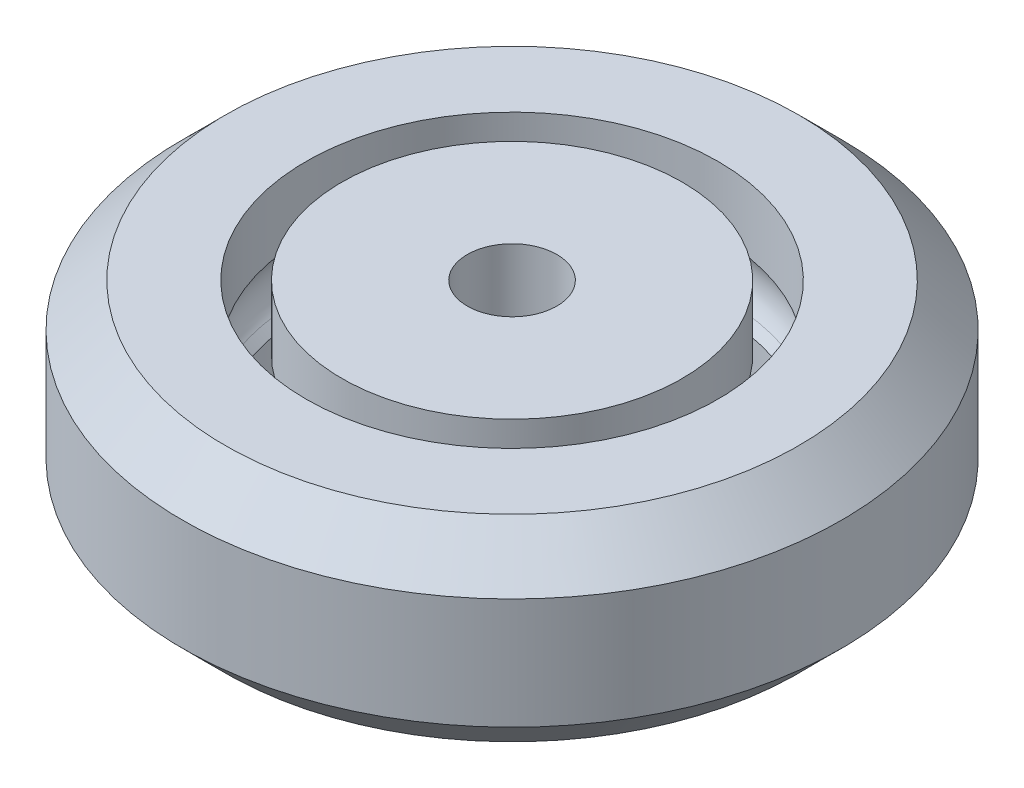
ISO-10303-21;
HEADER;
FILE_DESCRIPTION(('STEP AP214'),'2;1');
FILE_NAME('part.step','',(''),(''),'','','');
FILE_SCHEMA(('AUTOMOTIVE_DESIGN { 1 0 10303 214 1 1 1 1 }'));
ENDSEC;
DATA;
#1=APPLICATION_CONTEXT('core data for automotive mechanical design processes');
#2=APPLICATION_PROTOCOL_DEFINITION('international standard','automotive_design',2000,#1);
#3=PRODUCT_CONTEXT('',#1,'mechanical');
#4=PRODUCT('Part','Part','',(#3));
#5=PRODUCT_RELATED_PRODUCT_CATEGORY('part','',(#4));
#6=PRODUCT_DEFINITION_FORMATION('','',#4);
#7=PRODUCT_DEFINITION_CONTEXT('part definition',#1,'design');
#8=PRODUCT_DEFINITION('design','',#6,#7);
#9=PRODUCT_DEFINITION_SHAPE('','',#8);
#10=(LENGTH_UNIT() NAMED_UNIT(*) SI_UNIT(.MILLI.,.METRE.));
#11=(NAMED_UNIT(*) PLANE_ANGLE_UNIT() SI_UNIT($,.RADIAN.));
#12=(NAMED_UNIT(*) SI_UNIT($,.STERADIAN.) SOLID_ANGLE_UNIT());
#13=UNCERTAINTY_MEASURE_WITH_UNIT(LENGTH_MEASURE(1.E-05),#10,'distance_accuracy_value','');
#14=(GEOMETRIC_REPRESENTATION_CONTEXT(3) GLOBAL_UNCERTAINTY_ASSIGNED_CONTEXT((#13)) GLOBAL_UNIT_ASSIGNED_CONTEXT((#10,
#11,#12)) REPRESENTATION_CONTEXT('',''));
#15=CARTESIAN_POINT('',(0.,0.,0.));
#16=DIRECTION('',(0.,0.,1.));
#17=DIRECTION('',(1.,0.,0.));
#18=AXIS2_PLACEMENT_3D('',#15,#16,#17);
#19=CARTESIAN_POINT('',(0.,0.,0.));
#20=DIRECTION('',(0.,-1.,0.));
#21=DIRECTION('',(0.,0.,-1.));
#22=AXIS2_PLACEMENT_3D('',#19,#20,#21);
#23=TOROIDAL_SURFACE('',#22,10.5,2.025);
#24=CARTESIAN_POINT('',(0.,1.43189123190276,0.));
#25=DIRECTION('',(0.,-1.,0.));
#26=DIRECTION('',(0.,0.,-1.));
#27=AXIS2_PLACEMENT_3D('',#24,#25,#26);
#28=CIRCLE('',#27,11.9318912319028);
#29=CARTESIAN_POINT('',(0.,1.43189123190276,-11.9318912319028));
#30=VERTEX_POINT('',#29);
#31=EDGE_CURVE('E93',#30,#30,#28,.T.);
#32=ORIENTED_EDGE('',*,*,#31,.F.);
#33=EDGE_LOOP('',(#32));
#34=FACE_BOUND('',#33,.T.);
#35=CARTESIAN_POINT('',(0.,-1.43189123190276,0.));
#36=DIRECTION('',(0.,-1.,0.));
#37=DIRECTION('',(0.,0.,-1.));
#38=AXIS2_PLACEMENT_3D('',#35,#36,#37);
#39=CIRCLE('',#38,11.9318912319028);
#40=CARTESIAN_POINT('',(0.,-1.43189123190276,-11.9318912319028));
#41=VERTEX_POINT('',#40);
#42=EDGE_CURVE('E11',#41,#41,#39,.T.);
#43=ORIENTED_EDGE('',*,*,#42,.T.);
#44=EDGE_LOOP('',(#43));
#45=FACE_BOUND('',#44,.T.);
#46=ADVANCED_FACE('F50',(#34,#45),#23,.F.);
#47=CARTESIAN_POINT('',(0.,-1.43189123190276,0.));
#48=DIRECTION('',(0.,1.,0.));
#49=DIRECTION('',(0.,0.,1.));
#50=AXIS2_PLACEMENT_3D('',#47,#48,#49);
#51=CONICAL_SURFACE('',#50,11.9318912319028,0.785398163397442);
#52=CARTESIAN_POINT('',(0.,-1.86378246380552,0.));
#53=DIRECTION('',(0.,-1.,0.));
#54=DIRECTION('',(0.,0.,-1.));
#55=AXIS2_PLACEMENT_3D('',#52,#53,#54);
#56=CIRCLE('',#55,11.5);
#57=CARTESIAN_POINT('',(0.,-1.86378246380552,-11.5));
#58=VERTEX_POINT('',#57);
#59=EDGE_CURVE('E57',#58,#58,#56,.T.);
#60=ORIENTED_EDGE('',*,*,#59,.T.);
#61=EDGE_LOOP('',(#60));
#62=FACE_BOUND('',#61,.T.);
#63=ORIENTED_EDGE('',*,*,#42,.F.);
#64=EDGE_LOOP('',(#63));
#65=FACE_BOUND('',#64,.T.);
#66=ADVANCED_FACE('F101',(#62,#65),#51,.F.);
#67=CARTESIAN_POINT('',(0.,0.,0.));
#68=DIRECTION('',(0.,-1.,0.));
#69=DIRECTION('',(0.,0.,-1.));
#70=AXIS2_PLACEMENT_3D('',#67,#68,#69);
#71=CYLINDRICAL_SURFACE('',#70,11.5);
#72=CARTESIAN_POINT('',(0.,-5.5,0.));
#73=DIRECTION('',(0.,-1.,0.));
#74=DIRECTION('',(0.,0.,-1.));
#75=AXIS2_PLACEMENT_3D('',#72,#73,#74);
#76=CIRCLE('',#75,11.5);
#77=CARTESIAN_POINT('',(0.,-5.5,-11.5));
#78=VERTEX_POINT('',#77);
#79=EDGE_CURVE('E62',#78,#78,#76,.T.);
#80=ORIENTED_EDGE('',*,*,#79,.T.);
#81=EDGE_LOOP('',(#80));
#82=FACE_BOUND('',#81,.T.);
#83=ORIENTED_EDGE('',*,*,#59,.F.);
#84=EDGE_LOOP('',(#83));
#85=FACE_BOUND('',#84,.T.);
#86=ADVANCED_FACE('F105',(#82,#85),#71,.F.);
#87=CARTESIAN_POINT('',(0.,-5.5,0.));
#88=DIRECTION('',(0.,-1.,0.));
#89=DIRECTION('',(0.,0.,-1.));
#90=AXIS2_PLACEMENT_3D('',#87,#88,#89);
#91=PLANE('',#90);
#92=CARTESIAN_POINT('',(0.,-5.5,0.));
#93=DIRECTION('',(0.,-1.,0.));
#94=DIRECTION('',(0.,0.,-1.));
#95=AXIS2_PLACEMENT_3D('',#92,#93,#94);
#96=CIRCLE('',#95,16.);
#97=CARTESIAN_POINT('',(0.,-5.5,-16.));
#98=VERTEX_POINT('',#97);
#99=EDGE_CURVE('E67',#98,#98,#96,.T.);
#100=ORIENTED_EDGE('',*,*,#99,.T.);
#101=EDGE_LOOP('',(#100));
#102=FACE_BOUND('',#101,.T.);
#103=ORIENTED_EDGE('',*,*,#79,.F.);
#104=EDGE_LOOP('',(#103));
#105=FACE_BOUND('',#104,.T.);
#106=ADVANCED_FACE('F109',(#102,#105),#91,.T.);
#107=CARTESIAN_POINT('',(0.,-3.1,0.));
#108=DIRECTION('',(0.,1.,0.));
#109=DIRECTION('',(0.,0.,1.));
#110=AXIS2_PLACEMENT_3D('',#107,#108,#109);
#111=CONICAL_SURFACE('',#110,18.4,0.785398163397442);
#112=ORIENTED_EDGE('',*,*,#99,.F.);
#113=EDGE_LOOP('',(#112));
#114=FACE_BOUND('',#113,.T.);
#115=CARTESIAN_POINT('',(0.,-3.1,0.));
#116=DIRECTION('',(0.,-1.,0.));
#117=DIRECTION('',(0.,0.,-1.));
#118=AXIS2_PLACEMENT_3D('',#115,#116,#117);
#119=CIRCLE('',#118,18.4);
#120=CARTESIAN_POINT('',(0.,-3.1,-18.4));
#121=VERTEX_POINT('',#120);
#122=EDGE_CURVE('E73',#121,#121,#119,.T.);
#123=ORIENTED_EDGE('',*,*,#122,.T.);
#124=EDGE_LOOP('',(#123));
#125=FACE_BOUND('',#124,.T.);
#126=ADVANCED_FACE('F116',(#114,#125),#111,.T.);
#127=CARTESIAN_POINT('',(0.,0.,0.));
#128=DIRECTION('',(0.,-1.,0.));
#129=DIRECTION('',(0.,0.,-1.));
#130=AXIS2_PLACEMENT_3D('',#127,#128,#129);
#131=CYLINDRICAL_SURFACE('',#130,18.4);
#132=CARTESIAN_POINT('',(0.,3.1,0.));
#133=DIRECTION('',(0.,-1.,0.));
#134=DIRECTION('',(0.,0.,-1.));
#135=AXIS2_PLACEMENT_3D('',#132,#133,#134);
#136=CIRCLE('',#135,18.4);
#137=CARTESIAN_POINT('',(0.,3.1,-18.4));
#138=VERTEX_POINT('',#137);
#139=EDGE_CURVE('E77',#138,#138,#136,.T.);
#140=ORIENTED_EDGE('',*,*,#139,.T.);
#141=EDGE_LOOP('',(#140));
#142=FACE_BOUND('',#141,.T.);
#143=ORIENTED_EDGE('',*,*,#122,.F.);
#144=EDGE_LOOP('',(#143));
#145=FACE_BOUND('',#144,.T.);
#146=ADVANCED_FACE('F120',(#142,#145),#131,.T.);
#147=CARTESIAN_POINT('',(0.,3.1,0.));
#148=DIRECTION('',(0.,-1.,0.));
#149=DIRECTION('',(0.,0.,-1.));
#150=AXIS2_PLACEMENT_3D('',#147,#148,#149);
#151=CONICAL_SURFACE('',#150,18.4,0.785398163397442);
#152=CARTESIAN_POINT('',(0.,5.5,0.));
#153=DIRECTION('',(0.,-1.,0.));
#154=DIRECTION('',(0.,0.,-1.));
#155=AXIS2_PLACEMENT_3D('',#152,#153,#154);
#156=CIRCLE('',#155,16.);
#157=CARTESIAN_POINT('',(0.,5.5,-16.));
#158=VERTEX_POINT('',#157);
#159=EDGE_CURVE('E81',#158,#158,#156,.T.);
#160=ORIENTED_EDGE('',*,*,#159,.T.);
#161=EDGE_LOOP('',(#160));
#162=FACE_BOUND('',#161,.T.);
#163=ORIENTED_EDGE('',*,*,#139,.F.);
#164=EDGE_LOOP('',(#163));
#165=FACE_BOUND('',#164,.T.);
#166=ADVANCED_FACE('F124',(#162,#165),#151,.T.);
#167=CARTESIAN_POINT('',(0.,5.5,0.));
#168=DIRECTION('',(0.,-1.,0.));
#169=DIRECTION('',(0.,0.,-1.));
#170=AXIS2_PLACEMENT_3D('',#167,#168,#169);
#171=PLANE('',#170);
#172=ORIENTED_EDGE('',*,*,#159,.F.);
#173=EDGE_LOOP('',(#172));
#174=FACE_BOUND('',#173,.T.);
#175=CARTESIAN_POINT('',(0.,5.5,0.));
#176=DIRECTION('',(0.,-1.,0.));
#177=DIRECTION('',(0.,0.,-1.));
#178=AXIS2_PLACEMENT_3D('',#175,#176,#177);
#179=CIRCLE('',#178,11.5);
#180=CARTESIAN_POINT('',(0.,5.5,-11.5));
#181=VERTEX_POINT('',#180);
#182=EDGE_CURVE('E85',#181,#181,#179,.T.);
#183=ORIENTED_EDGE('',*,*,#182,.T.);
#184=EDGE_LOOP('',(#183));
#185=FACE_BOUND('',#184,.T.);
#186=ADVANCED_FACE('F128',(#174,#185),#171,.F.);
#187=CARTESIAN_POINT('',(0.,0.,0.));
#188=DIRECTION('',(0.,-1.,0.));
#189=DIRECTION('',(0.,0.,-1.));
#190=AXIS2_PLACEMENT_3D('',#187,#188,#189);
#191=CYLINDRICAL_SURFACE('',#190,11.5);
#192=ORIENTED_EDGE('',*,*,#182,.F.);
#193=EDGE_LOOP('',(#192));
#194=FACE_BOUND('',#193,.T.);
#195=CARTESIAN_POINT('',(0.,1.86378246380552,0.));
#196=DIRECTION('',(0.,-1.,0.));
#197=DIRECTION('',(0.,0.,-1.));
#198=AXIS2_PLACEMENT_3D('',#195,#196,#197);
#199=CIRCLE('',#198,11.5);
#200=CARTESIAN_POINT('',(0.,1.86378246380552,-11.5));
#201=VERTEX_POINT('',#200);
#202=EDGE_CURVE('E89',#201,#201,#199,.T.);
#203=ORIENTED_EDGE('',*,*,#202,.T.);
#204=EDGE_LOOP('',(#203));
#205=FACE_BOUND('',#204,.T.);
#206=ADVANCED_FACE('F132',(#194,#205),#191,.F.);
#207=CARTESIAN_POINT('',(0.,1.43189123190276,0.));
#208=DIRECTION('',(0.,-1.,0.));
#209=DIRECTION('',(0.,0.,-1.));
#210=AXIS2_PLACEMENT_3D('',#207,#208,#209);
#211=CONICAL_SURFACE('',#210,11.9318912319028,0.785398163397442);
#212=ORIENTED_EDGE('',*,*,#202,.F.);
#213=EDGE_LOOP('',(#212));
#214=FACE_BOUND('',#213,.T.);
#215=ORIENTED_EDGE('',*,*,#31,.T.);
#216=EDGE_LOOP('',(#215));
#217=FACE_BOUND('',#216,.T.);
#218=ADVANCED_FACE('F98',(#214,#217),#211,.F.);
#219=CLOSED_SHELL('',(#46,#66,#86,#106,#126,#146,#166,#186,#206,#218));
#220=MANIFOLD_SOLID_BREP('B2',#219);
#221=CARTESIAN_POINT('',(0.,5.5,0.));
#222=DIRECTION('',(0.,1.,0.));
#223=DIRECTION('',(0.,0.,1.));
#224=AXIS2_PLACEMENT_3D('',#221,#222,#223);
#225=PLANE('',#224);
#226=CARTESIAN_POINT('',(0.,5.5,0.));
#227=DIRECTION('',(0.,-1.,0.));
#228=DIRECTION('',(0.,0.,-1.));
#229=AXIS2_PLACEMENT_3D('',#226,#227,#228);
#230=CIRCLE('',#229,2.5);
#231=CARTESIAN_POINT('',(0.,5.5,-2.5));
#232=VERTEX_POINT('',#231);
#233=EDGE_CURVE('E49',#232,#232,#230,.T.);
#234=ORIENTED_EDGE('',*,*,#233,.T.);
#235=EDGE_LOOP('',(#234));
#236=FACE_BOUND('',#235,.T.);
#237=CARTESIAN_POINT('',(0.,5.5,0.));
#238=DIRECTION('',(0.,-1.,0.));
#239=DIRECTION('',(0.,0.,-1.));
#240=AXIS2_PLACEMENT_3D('',#237,#238,#239);
#241=CIRCLE('',#240,9.5);
#242=CARTESIAN_POINT('',(0.,5.5,-9.5));
#243=VERTEX_POINT('',#242);
#244=EDGE_CURVE('E259',#243,#243,#241,.T.);
#245=ORIENTED_EDGE('',*,*,#244,.F.);
#246=EDGE_LOOP('',(#245));
#247=FACE_BOUND('',#246,.T.);
#248=ADVANCED_FACE('F231',(#236,#247),#225,.T.);
#249=CARTESIAN_POINT('',(0.,0.,0.));
#250=DIRECTION('',(0.,-1.,0.));
#251=DIRECTION('',(0.,0.,-1.));
#252=AXIS2_PLACEMENT_3D('',#249,#250,#251);
#253=CYLINDRICAL_SURFACE('',#252,2.5);
#254=CARTESIAN_POINT('',(0.,-5.5,0.));
#255=DIRECTION('',(0.,-1.,0.));
#256=DIRECTION('',(0.,0.,-1.));
#257=AXIS2_PLACEMENT_3D('',#254,#255,#256);
#258=CIRCLE('',#257,2.5);
#259=CARTESIAN_POINT('',(0.,-5.5,-2.5));
#260=VERTEX_POINT('',#259);
#261=EDGE_CURVE('E237',#260,#260,#258,.T.);
#262=ORIENTED_EDGE('',*,*,#261,.T.);
#263=EDGE_LOOP('',(#262));
#264=FACE_BOUND('',#263,.T.);
#265=ORIENTED_EDGE('',*,*,#233,.F.);
#266=EDGE_LOOP('',(#265));
#267=FACE_BOUND('',#266,.T.);
#268=ADVANCED_FACE('F267',(#264,#267),#253,.F.);
#269=CARTESIAN_POINT('',(0.,-5.5,0.));
#270=DIRECTION('',(0.,1.,0.));
#271=DIRECTION('',(0.,0.,1.));
#272=AXIS2_PLACEMENT_3D('',#269,#270,#271);
#273=PLANE('',#272);
#274=ORIENTED_EDGE('',*,*,#261,.F.);
#275=EDGE_LOOP('',(#274));
#276=FACE_BOUND('',#275,.T.);
#277=CARTESIAN_POINT('',(0.,-5.5,0.));
#278=DIRECTION('',(0.,-1.,0.));
#279=DIRECTION('',(0.,0.,-1.));
#280=AXIS2_PLACEMENT_3D('',#277,#278,#279);
#281=CIRCLE('',#280,9.5);
#282=CARTESIAN_POINT('',(0.,-5.5,-9.5));
#283=VERTEX_POINT('',#282);
#284=EDGE_CURVE('E241',#283,#283,#281,.T.);
#285=ORIENTED_EDGE('',*,*,#284,.T.);
#286=EDGE_LOOP('',(#285));
#287=FACE_BOUND('',#286,.T.);
#288=ADVANCED_FACE('F271',(#276,#287),#273,.F.);
#289=CARTESIAN_POINT('',(0.,0.,0.));
#290=DIRECTION('',(0.,-1.,0.));
#291=DIRECTION('',(0.,0.,-1.));
#292=AXIS2_PLACEMENT_3D('',#289,#290,#291);
#293=CYLINDRICAL_SURFACE('',#292,9.5);
#294=ORIENTED_EDGE('',*,*,#284,.F.);
#295=EDGE_LOOP('',(#294));
#296=FACE_BOUND('',#295,.T.);
#297=CARTESIAN_POINT('',(0.,-1.86378246380552,0.));
#298=DIRECTION('',(0.,-1.,0.));
#299=DIRECTION('',(0.,0.,-1.));
#300=AXIS2_PLACEMENT_3D('',#297,#298,#299);
#301=CIRCLE('',#300,9.5);
#302=CARTESIAN_POINT('',(0.,-1.86378246380552,-9.5));
#303=VERTEX_POINT('',#302);
#304=EDGE_CURVE('E245',#303,#303,#301,.T.);
#305=ORIENTED_EDGE('',*,*,#304,.T.);
#306=EDGE_LOOP('',(#305));
#307=FACE_BOUND('',#306,.T.);
#308=ADVANCED_FACE('F275',(#296,#307),#293,.T.);
#309=CARTESIAN_POINT('',(0.,-1.43189123190275,0.));
#310=DIRECTION('',(0.,-1.,0.));
#311=DIRECTION('',(0.,0.,-1.));
#312=AXIS2_PLACEMENT_3D('',#309,#310,#311);
#313=CONICAL_SURFACE('',#312,9.06810876809724,0.785398163397443);
#314=ORIENTED_EDGE('',*,*,#304,.F.);
#315=EDGE_LOOP('',(#314));
#316=FACE_BOUND('',#315,.T.);
#317=CARTESIAN_POINT('',(0.,-1.43189123190275,0.));
#318=DIRECTION('',(0.,-1.,0.));
#319=DIRECTION('',(0.,0.,-1.));
#320=AXIS2_PLACEMENT_3D('',#317,#318,#319);
#321=CIRCLE('',#320,9.06810876809724);
#322=CARTESIAN_POINT('',(0.,-1.43189123190275,-9.06810876809724));
#323=VERTEX_POINT('',#322);
#324=EDGE_CURVE('E250',#323,#323,#321,.T.);
#325=ORIENTED_EDGE('',*,*,#324,.T.);
#326=EDGE_LOOP('',(#325));
#327=FACE_BOUND('',#326,.T.);
#328=ADVANCED_FACE('F282',(#316,#327),#313,.T.);
#329=CARTESIAN_POINT('',(0.,0.,0.));
#330=DIRECTION('',(0.,-1.,0.));
#331=DIRECTION('',(0.,0.,-1.));
#332=AXIS2_PLACEMENT_3D('',#329,#330,#331);
#333=TOROIDAL_SURFACE('',#332,10.5,2.025);
#334=CARTESIAN_POINT('',(0.,1.43189123190275,0.));
#335=DIRECTION('',(0.,-1.,0.));
#336=DIRECTION('',(0.,0.,-1.));
#337=AXIS2_PLACEMENT_3D('',#334,#335,#336);
#338=CIRCLE('',#337,9.06810876809724);
#339=CARTESIAN_POINT('',(0.,1.43189123190275,-9.06810876809724));
#340=VERTEX_POINT('',#339);
#341=EDGE_CURVE('E253',#340,#340,#338,.T.);
#342=ORIENTED_EDGE('',*,*,#341,.T.);
#343=EDGE_LOOP('',(#342));
#344=FACE_BOUND('',#343,.T.);
#345=ORIENTED_EDGE('',*,*,#324,.F.);
#346=EDGE_LOOP('',(#345));
#347=FACE_BOUND('',#346,.T.);
#348=ADVANCED_FACE('F286',(#344,#347),#333,.F.);
#349=CARTESIAN_POINT('',(0.,1.43189123190275,0.));
#350=DIRECTION('',(0.,1.,0.));
#351=DIRECTION('',(0.,0.,1.));
#352=AXIS2_PLACEMENT_3D('',#349,#350,#351);
#353=CONICAL_SURFACE('',#352,9.06810876809724,0.785398163397443);
#354=CARTESIAN_POINT('',(0.,1.86378246380552,0.));
#355=DIRECTION('',(0.,-1.,0.));
#356=DIRECTION('',(0.,0.,-1.));
#357=AXIS2_PLACEMENT_3D('',#354,#355,#356);
#358=CIRCLE('',#357,9.5);
#359=CARTESIAN_POINT('',(0.,1.86378246380552,-9.5));
#360=VERTEX_POINT('',#359);
#361=EDGE_CURVE('E256',#360,#360,#358,.T.);
#362=ORIENTED_EDGE('',*,*,#361,.T.);
#363=EDGE_LOOP('',(#362));
#364=FACE_BOUND('',#363,.T.);
#365=ORIENTED_EDGE('',*,*,#341,.F.);
#366=EDGE_LOOP('',(#365));
#367=FACE_BOUND('',#366,.T.);
#368=ADVANCED_FACE('F290',(#364,#367),#353,.T.);
#369=CARTESIAN_POINT('',(0.,0.,0.));
#370=DIRECTION('',(0.,-1.,0.));
#371=DIRECTION('',(0.,0.,-1.));
#372=AXIS2_PLACEMENT_3D('',#369,#370,#371);
#373=CYLINDRICAL_SURFACE('',#372,9.5);
#374=ORIENTED_EDGE('',*,*,#244,.T.);
#375=EDGE_LOOP('',(#374));
#376=FACE_BOUND('',#375,.T.);
#377=ORIENTED_EDGE('',*,*,#361,.F.);
#378=EDGE_LOOP('',(#377));
#379=FACE_BOUND('',#378,.T.);
#380=ADVANCED_FACE('F263',(#376,#379),#373,.T.);
#381=CLOSED_SHELL('',(#248,#268,#288,#308,#328,#348,#368,#380));
#382=MANIFOLD_SOLID_BREP('B6',#381);
#383=ADVANCED_BREP_SHAPE_REPRESENTATION('',(#18,#220,#382),#14);
#384=SHAPE_DEFINITION_REPRESENTATION(#9,#383);
ENDSEC;
END-ISO-10303-21;
